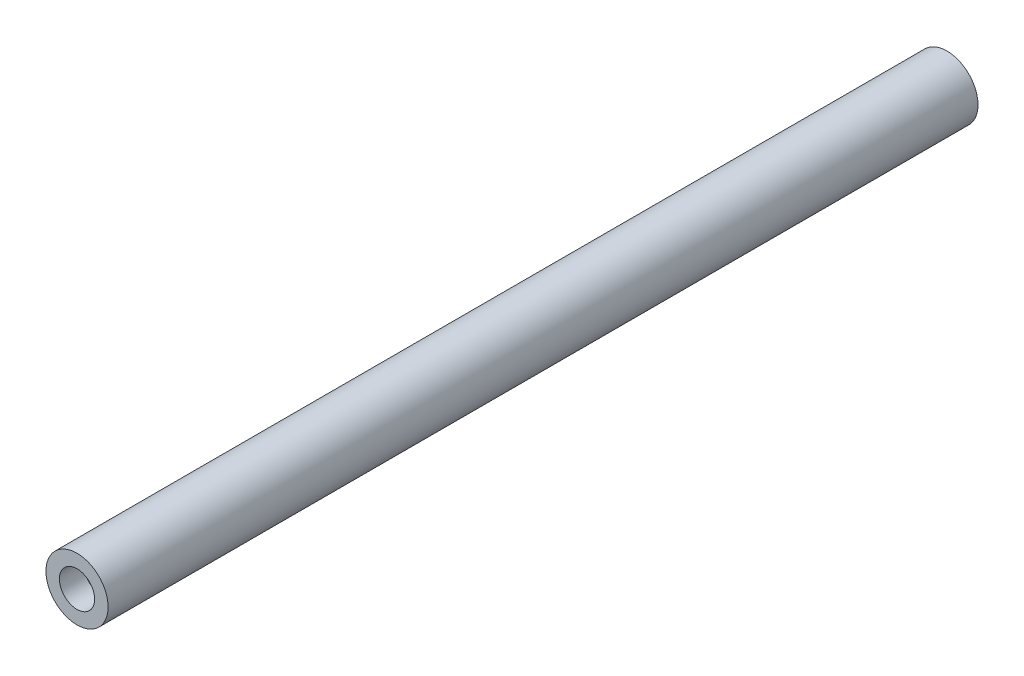
ISO-10303-21;
HEADER;
FILE_DESCRIPTION(('STEP AP214'),'2;1');
FILE_NAME('part.step','',(''),(''),'','','');
FILE_SCHEMA(('AUTOMOTIVE_DESIGN { 1 0 10303 214 1 1 1 1 }'));
ENDSEC;
DATA;
#1=APPLICATION_CONTEXT('core data for automotive mechanical design processes');
#2=APPLICATION_PROTOCOL_DEFINITION('international standard','automotive_design',2000,#1);
#3=PRODUCT_CONTEXT('',#1,'mechanical');
#4=PRODUCT('Part','Part','',(#3));
#5=PRODUCT_RELATED_PRODUCT_CATEGORY('part','',(#4));
#6=PRODUCT_DEFINITION_FORMATION('','',#4);
#7=PRODUCT_DEFINITION_CONTEXT('part definition',#1,'design');
#8=PRODUCT_DEFINITION('design','',#6,#7);
#9=PRODUCT_DEFINITION_SHAPE('','',#8);
#10=(LENGTH_UNIT() NAMED_UNIT(*) SI_UNIT(.MILLI.,.METRE.));
#11=(NAMED_UNIT(*) PLANE_ANGLE_UNIT() SI_UNIT($,.RADIAN.));
#12=(NAMED_UNIT(*) SI_UNIT($,.STERADIAN.) SOLID_ANGLE_UNIT());
#13=UNCERTAINTY_MEASURE_WITH_UNIT(LENGTH_MEASURE(1.E-05),#10,'distance_accuracy_value','');
#14=(GEOMETRIC_REPRESENTATION_CONTEXT(3) GLOBAL_UNCERTAINTY_ASSIGNED_CONTEXT((#13)) GLOBAL_UNIT_ASSIGNED_CONTEXT((#10,
#11,#12)) REPRESENTATION_CONTEXT('',''));
#15=CARTESIAN_POINT('',(0.,0.,0.));
#16=DIRECTION('',(0.,0.,1.));
#17=DIRECTION('',(1.,0.,0.));
#18=AXIS2_PLACEMENT_3D('',#15,#16,#17);
#19=CARTESIAN_POINT('',(0.,0.,-177.8));
#20=DIRECTION('',(0.,0.,1.));
#21=DIRECTION('',(1.,0.,0.));
#22=AXIS2_PLACEMENT_3D('',#19,#20,#21);
#23=CYLINDRICAL_SURFACE('',#22,6.35);
#24=CARTESIAN_POINT('',(0.,0.,-177.8));
#25=DIRECTION('',(0.,0.,1.));
#26=DIRECTION('',(1.,0.,0.));
#27=AXIS2_PLACEMENT_3D('',#24,#25,#26);
#28=CIRCLE('',#27,6.35);
#29=CARTESIAN_POINT('',(6.35,0.,-177.8));
#30=VERTEX_POINT('',#29);
#31=EDGE_CURVE('E10',#30,#30,#28,.T.);
#32=ORIENTED_EDGE('',*,*,#31,.T.);
#33=EDGE_LOOP('',(#32));
#34=FACE_BOUND('',#33,.T.);
#35=CARTESIAN_POINT('',(0.,0.,0.));
#36=DIRECTION('',(0.,0.,1.));
#37=DIRECTION('',(1.,0.,0.));
#38=AXIS2_PLACEMENT_3D('',#35,#36,#37);
#39=CIRCLE('',#38,6.35);
#40=CARTESIAN_POINT('',(6.35,0.,0.));
#41=VERTEX_POINT('',#40);
#42=EDGE_CURVE('E39',#41,#41,#39,.T.);
#43=ORIENTED_EDGE('',*,*,#42,.F.);
#44=EDGE_LOOP('',(#43));
#45=FACE_BOUND('',#44,.T.);
#46=ADVANCED_FACE('F36',(#34,#45),#23,.T.);
#47=CARTESIAN_POINT('',(0.,0.,-177.8));
#48=DIRECTION('',(0.,0.,1.));
#49=DIRECTION('',(1.,0.,0.));
#50=AXIS2_PLACEMENT_3D('',#47,#48,#49);
#51=PLANE('',#50);
#52=ORIENTED_EDGE('',*,*,#31,.F.);
#53=EDGE_LOOP('',(#52));
#54=FACE_BOUND('',#53,.T.);
#55=ADVANCED_FACE('F65',(#54),#51,.F.);
#56=CARTESIAN_POINT('',(0.,0.,0.));
#57=DIRECTION('',(0.,0.,1.));
#58=DIRECTION('',(1.,0.,0.));
#59=AXIS2_PLACEMENT_3D('',#56,#57,#58);
#60=PLANE('',#59);
#61=CARTESIAN_POINT('',(0.,0.,0.));
#62=DIRECTION('',(0.,0.,1.));
#63=DIRECTION('',(1.,0.,0.));
#64=AXIS2_PLACEMENT_3D('',#61,#62,#63);
#65=CIRCLE('',#64,3.6);
#66=CARTESIAN_POINT('',(3.6,0.,0.));
#67=VERTEX_POINT('',#66);
#68=EDGE_CURVE('E48',#67,#67,#65,.T.);
#69=ORIENTED_EDGE('',*,*,#68,.F.);
#70=EDGE_LOOP('',(#69));
#71=FACE_BOUND('',#70,.T.);
#72=ORIENTED_EDGE('',*,*,#42,.T.);
#73=EDGE_LOOP('',(#72));
#74=FACE_BOUND('',#73,.T.);
#75=ADVANCED_FACE('F59',(#71,#74),#60,.T.);
#76=CARTESIAN_POINT('',(0.,0.,-5.));
#77=DIRECTION('',(0.,0.,1.));
#78=DIRECTION('',(1.,0.,0.));
#79=AXIS2_PLACEMENT_3D('',#76,#77,#78);
#80=CYLINDRICAL_SURFACE('',#79,3.6);
#81=CARTESIAN_POINT('',(0.,0.,-5.));
#82=DIRECTION('',(0.,0.,1.));
#83=DIRECTION('',(1.,0.,0.));
#84=AXIS2_PLACEMENT_3D('',#81,#82,#83);
#85=CIRCLE('',#84,3.6);
#86=CARTESIAN_POINT('',(3.6,0.,-5.));
#87=VERTEX_POINT('',#86);
#88=EDGE_CURVE('E46',#87,#87,#85,.T.);
#89=ORIENTED_EDGE('',*,*,#88,.F.);
#90=EDGE_LOOP('',(#89));
#91=FACE_BOUND('',#90,.T.);
#92=ORIENTED_EDGE('',*,*,#68,.T.);
#93=EDGE_LOOP('',(#92));
#94=FACE_BOUND('',#93,.T.);
#95=ADVANCED_FACE('F56',(#91,#94),#80,.F.);
#96=CARTESIAN_POINT('',(0.,0.,-5.));
#97=DIRECTION('',(0.,0.,1.));
#98=DIRECTION('',(1.,0.,0.));
#99=AXIS2_PLACEMENT_3D('',#96,#97,#98);
#100=PLANE('',#99);
#101=ORIENTED_EDGE('',*,*,#88,.T.);
#102=EDGE_LOOP('',(#101));
#103=FACE_BOUND('',#102,.T.);
#104=ADVANCED_FACE('F54',(#103),#100,.T.);
#105=CLOSED_SHELL('',(#46,#55,#75,#95,#104));
#106=MANIFOLD_SOLID_BREP('B2',#105);
#107=ADVANCED_BREP_SHAPE_REPRESENTATION('',(#18,#106),#14);
#108=SHAPE_DEFINITION_REPRESENTATION(#9,#107);
ENDSEC;
END-ISO-10303-21;
